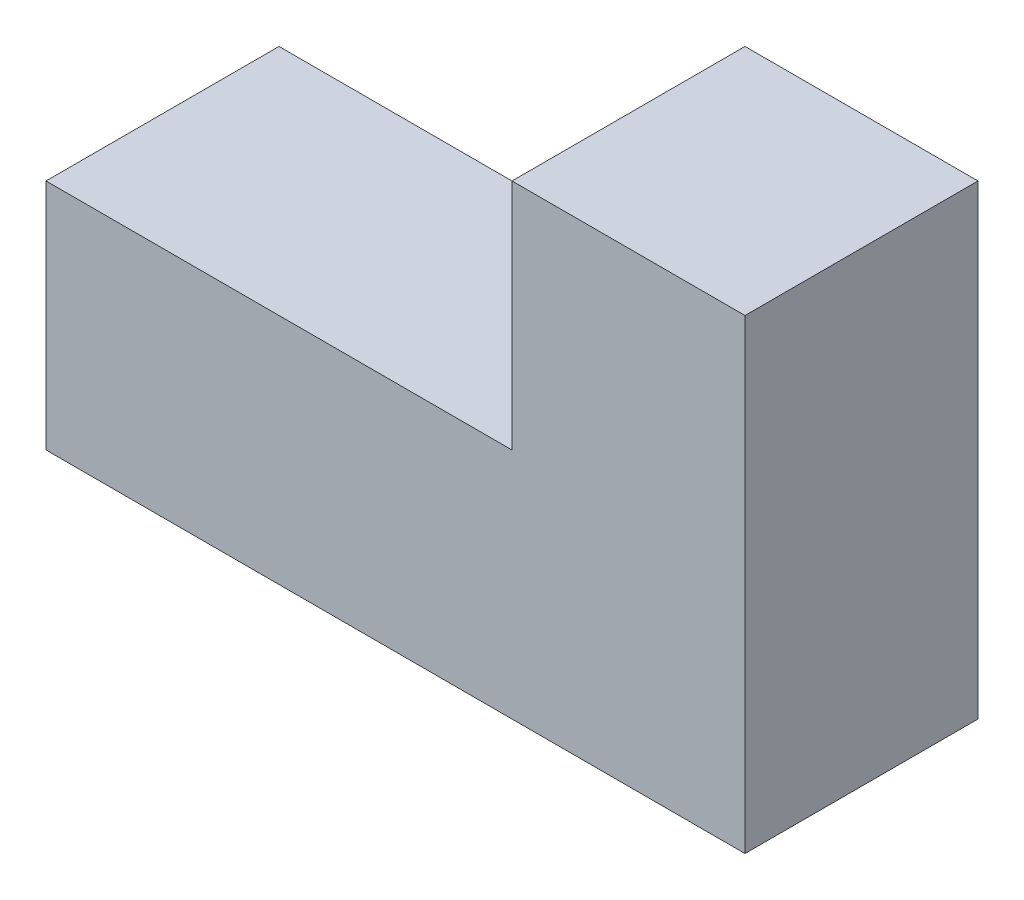
ISO-10303-21;
HEADER;
FILE_DESCRIPTION(('STEP AP214'),'2;1');
FILE_NAME('part.step','',(''),(''),'','','');
FILE_SCHEMA(('AUTOMOTIVE_DESIGN { 1 0 10303 214 1 1 1 1 }'));
ENDSEC;
DATA;
#1=APPLICATION_CONTEXT('core data for automotive mechanical design processes');
#2=APPLICATION_PROTOCOL_DEFINITION('international standard','automotive_design',2000,#1);
#3=PRODUCT_CONTEXT('',#1,'mechanical');
#4=PRODUCT('Part','Part','',(#3));
#5=PRODUCT_RELATED_PRODUCT_CATEGORY('part','',(#4));
#6=PRODUCT_DEFINITION_FORMATION('','',#4);
#7=PRODUCT_DEFINITION_CONTEXT('part definition',#1,'design');
#8=PRODUCT_DEFINITION('design','',#6,#7);
#9=PRODUCT_DEFINITION_SHAPE('','',#8);
#10=(LENGTH_UNIT() NAMED_UNIT(*) SI_UNIT(.MILLI.,.METRE.));
#11=(NAMED_UNIT(*) PLANE_ANGLE_UNIT() SI_UNIT($,.RADIAN.));
#12=(NAMED_UNIT(*) SI_UNIT($,.STERADIAN.) SOLID_ANGLE_UNIT());
#13=UNCERTAINTY_MEASURE_WITH_UNIT(LENGTH_MEASURE(1.E-05),#10,'distance_accuracy_value','');
#14=(GEOMETRIC_REPRESENTATION_CONTEXT(3) GLOBAL_UNCERTAINTY_ASSIGNED_CONTEXT((#13)) GLOBAL_UNIT_ASSIGNED_CONTEXT((#10,
#11,#12)) REPRESENTATION_CONTEXT('',''));
#15=CARTESIAN_POINT('',(0.,0.,0.));
#16=DIRECTION('',(0.,0.,1.));
#17=DIRECTION('',(1.,0.,0.));
#18=AXIS2_PLACEMENT_3D('',#15,#16,#17);
#19=CARTESIAN_POINT('',(0.,0.,30.));
#20=DIRECTION('',(0.,-1.,0.));
#21=DIRECTION('',(0.,0.,-1.));
#22=AXIS2_PLACEMENT_3D('',#19,#20,#21);
#23=PLANE('',#22);
#24=DIRECTION('',(0.,0.,1.));
#25=VECTOR('',#24,1.);
#26=CARTESIAN_POINT('',(60.,0.,0.));
#27=LINE('',#26,#25);
#28=CARTESIAN_POINT('',(60.,0.,0.));
#29=VERTEX_POINT('',#28);
#30=CARTESIAN_POINT('',(60.,0.,30.));
#31=VERTEX_POINT('',#30);
#32=EDGE_CURVE('E48',#29,#31,#27,.T.);
#33=ORIENTED_EDGE('',*,*,#32,.F.);
#34=DIRECTION('',(-1.,0.,0.));
#35=VECTOR('',#34,1.);
#36=CARTESIAN_POINT('',(0.,0.,0.));
#37=LINE('',#36,#35);
#38=CARTESIAN_POINT('',(0.,0.,0.));
#39=VERTEX_POINT('',#38);
#40=EDGE_CURVE('E70',#29,#39,#37,.T.);
#41=ORIENTED_EDGE('',*,*,#40,.T.);
#42=DIRECTION('',(0.,0.,-1.));
#43=VECTOR('',#42,1.);
#44=CARTESIAN_POINT('',(0.,0.,30.));
#45=LINE('',#44,#43);
#46=CARTESIAN_POINT('',(0.,0.,30.));
#47=VERTEX_POINT('',#46);
#48=EDGE_CURVE('E131',#47,#39,#45,.T.);
#49=ORIENTED_EDGE('',*,*,#48,.F.);
#50=DIRECTION('',(-1.,0.,0.));
#51=VECTOR('',#50,1.);
#52=CARTESIAN_POINT('',(0.,0.,30.));
#53=LINE('',#52,#51);
#54=EDGE_CURVE('E56',#31,#47,#53,.T.);
#55=ORIENTED_EDGE('',*,*,#54,.F.);
#56=EDGE_LOOP('',(#33,#41,#49,#55));
#57=FACE_BOUND('',#56,.T.);
#58=ADVANCED_FACE('F33',(#57),#23,.F.);
#59=CARTESIAN_POINT('',(0.,-30.,30.));
#60=DIRECTION('',(1.,0.,0.));
#61=DIRECTION('',(0.,1.,0.));
#62=AXIS2_PLACEMENT_3D('',#59,#60,#61);
#63=PLANE('',#62);
#64=DIRECTION('',(0.,-1.,0.));
#65=VECTOR('',#64,1.);
#66=CARTESIAN_POINT('',(0.,-30.,0.));
#67=LINE('',#66,#65);
#68=CARTESIAN_POINT('',(0.,-30.,0.));
#69=VERTEX_POINT('',#68);
#70=EDGE_CURVE('E124',#39,#69,#67,.T.);
#71=ORIENTED_EDGE('',*,*,#70,.T.);
#72=DIRECTION('',(0.,0.,-1.));
#73=VECTOR('',#72,1.);
#74=CARTESIAN_POINT('',(0.,-30.,30.));
#75=LINE('',#74,#73);
#76=CARTESIAN_POINT('',(0.,-30.,30.));
#77=VERTEX_POINT('',#76);
#78=EDGE_CURVE('E11',#77,#69,#75,.T.);
#79=ORIENTED_EDGE('',*,*,#78,.F.);
#80=DIRECTION('',(0.,-1.,0.));
#81=VECTOR('',#80,1.);
#82=CARTESIAN_POINT('',(0.,-30.,30.));
#83=LINE('',#82,#81);
#84=EDGE_CURVE('E125',#47,#77,#83,.T.);
#85=ORIENTED_EDGE('',*,*,#84,.F.);
#86=ORIENTED_EDGE('',*,*,#48,.T.);
#87=EDGE_LOOP('',(#71,#79,#85,#86));
#88=FACE_BOUND('',#87,.T.);
#89=ADVANCED_FACE('F35',(#88),#63,.F.);
#90=CARTESIAN_POINT('',(90.,-30.,30.));
#91=DIRECTION('',(0.,1.,0.));
#92=DIRECTION('',(-1.,0.,0.));
#93=AXIS2_PLACEMENT_3D('',#90,#91,#92);
#94=PLANE('',#93);
#95=DIRECTION('',(1.,0.,0.));
#96=VECTOR('',#95,1.);
#97=CARTESIAN_POINT('',(90.,-30.,0.));
#98=LINE('',#97,#96);
#99=CARTESIAN_POINT('',(90.,-30.,0.));
#100=VERTEX_POINT('',#99);
#101=EDGE_CURVE('E100',#69,#100,#98,.T.);
#102=ORIENTED_EDGE('',*,*,#101,.T.);
#103=DIRECTION('',(0.,0.,-1.));
#104=VECTOR('',#103,1.);
#105=CARTESIAN_POINT('',(90.,-30.,30.));
#106=LINE('',#105,#104);
#107=CARTESIAN_POINT('',(90.,-30.,30.));
#108=VERTEX_POINT('',#107);
#109=EDGE_CURVE('E41',#108,#100,#106,.T.);
#110=ORIENTED_EDGE('',*,*,#109,.F.);
#111=DIRECTION('',(1.,0.,0.));
#112=VECTOR('',#111,1.);
#113=CARTESIAN_POINT('',(90.,-30.,30.));
#114=LINE('',#113,#112);
#115=EDGE_CURVE('E75',#77,#108,#114,.T.);
#116=ORIENTED_EDGE('',*,*,#115,.F.);
#117=ORIENTED_EDGE('',*,*,#78,.T.);
#118=EDGE_LOOP('',(#102,#110,#116,#117));
#119=FACE_BOUND('',#118,.T.);
#120=ADVANCED_FACE('F139',(#119),#94,.F.);
#121=CARTESIAN_POINT('',(90.,0.,30.));
#122=DIRECTION('',(-1.,0.,0.));
#123=DIRECTION('',(0.,0.,1.));
#124=AXIS2_PLACEMENT_3D('',#121,#122,#123);
#125=PLANE('',#124);
#126=DIRECTION('',(0.,1.,0.));
#127=VECTOR('',#126,1.);
#128=CARTESIAN_POINT('',(90.,0.,0.));
#129=LINE('',#128,#127);
#130=CARTESIAN_POINT('',(90.,30.,0.));
#131=VERTEX_POINT('',#130);
#132=EDGE_CURVE('E93',#100,#131,#129,.T.);
#133=ORIENTED_EDGE('',*,*,#132,.T.);
#134=DIRECTION('',(0.,0.,-1.));
#135=VECTOR('',#134,1.);
#136=CARTESIAN_POINT('',(90.,30.,30.));
#137=LINE('',#136,#135);
#138=CARTESIAN_POINT('',(90.,30.,30.));
#139=VERTEX_POINT('',#138);
#140=EDGE_CURVE('E98',#139,#131,#137,.T.);
#141=ORIENTED_EDGE('',*,*,#140,.F.);
#142=DIRECTION('',(0.,1.,0.));
#143=VECTOR('',#142,1.);
#144=CARTESIAN_POINT('',(90.,0.,30.));
#145=LINE('',#144,#143);
#146=EDGE_CURVE('E128',#108,#139,#145,.T.);
#147=ORIENTED_EDGE('',*,*,#146,.F.);
#148=ORIENTED_EDGE('',*,*,#109,.T.);
#149=EDGE_LOOP('',(#133,#141,#147,#148));
#150=FACE_BOUND('',#149,.T.);
#151=ADVANCED_FACE('F95',(#150),#125,.F.);
#152=CARTESIAN_POINT('',(0.,0.,30.));
#153=DIRECTION('',(0.,0.,-1.));
#154=DIRECTION('',(-1.,0.,0.));
#155=AXIS2_PLACEMENT_3D('',#152,#153,#154);
#156=PLANE('',#155);
#157=ORIENTED_EDGE('',*,*,#84,.T.);
#158=ORIENTED_EDGE('',*,*,#115,.T.);
#159=ORIENTED_EDGE('',*,*,#146,.T.);
#160=DIRECTION('',(1.,0.,0.));
#161=VECTOR('',#160,1.);
#162=CARTESIAN_POINT('',(60.,30.,30.));
#163=LINE('',#162,#161);
#164=CARTESIAN_POINT('',(60.,30.,30.));
#165=VERTEX_POINT('',#164);
#166=EDGE_CURVE('E115',#165,#139,#163,.T.);
#167=ORIENTED_EDGE('',*,*,#166,.F.);
#168=DIRECTION('',(0.,-1.,0.));
#169=VECTOR('',#168,1.);
#170=CARTESIAN_POINT('',(60.,30.,30.));
#171=LINE('',#170,#169);
#172=EDGE_CURVE('E120',#165,#31,#171,.T.);
#173=ORIENTED_EDGE('',*,*,#172,.T.);
#174=ORIENTED_EDGE('',*,*,#54,.T.);
#175=EDGE_LOOP('',(#157,#158,#159,#167,#173,#174));
#176=FACE_BOUND('',#175,.T.);
#177=ADVANCED_FACE('F145',(#176),#156,.F.);
#178=CARTESIAN_POINT('',(0.,0.,0.));
#179=DIRECTION('',(0.,0.,-1.));
#180=DIRECTION('',(-1.,0.,0.));
#181=AXIS2_PLACEMENT_3D('',#178,#179,#180);
#182=PLANE('',#181);
#183=ORIENTED_EDGE('',*,*,#70,.F.);
#184=ORIENTED_EDGE('',*,*,#40,.F.);
#185=DIRECTION('',(0.,-1.,0.));
#186=VECTOR('',#185,1.);
#187=CARTESIAN_POINT('',(60.,30.,0.));
#188=LINE('',#187,#186);
#189=CARTESIAN_POINT('',(60.,30.,0.));
#190=VERTEX_POINT('',#189);
#191=EDGE_CURVE('E107',#190,#29,#188,.T.);
#192=ORIENTED_EDGE('',*,*,#191,.F.);
#193=DIRECTION('',(-1.,0.,0.));
#194=VECTOR('',#193,1.);
#195=CARTESIAN_POINT('',(90.,30.,0.));
#196=LINE('',#195,#194);
#197=EDGE_CURVE('E103',#131,#190,#196,.T.);
#198=ORIENTED_EDGE('',*,*,#197,.F.);
#199=ORIENTED_EDGE('',*,*,#132,.F.);
#200=ORIENTED_EDGE('',*,*,#101,.F.);
#201=EDGE_LOOP('',(#183,#184,#192,#198,#199,#200));
#202=FACE_BOUND('',#201,.T.);
#203=ADVANCED_FACE('F105',(#202),#182,.T.);
#204=CARTESIAN_POINT('',(60.,30.,0.));
#205=DIRECTION('',(1.,0.,0.));
#206=DIRECTION('',(0.,0.,-1.));
#207=AXIS2_PLACEMENT_3D('',#204,#205,#206);
#208=PLANE('',#207);
#209=ORIENTED_EDGE('',*,*,#32,.T.);
#210=ORIENTED_EDGE('',*,*,#172,.F.);
#211=DIRECTION('',(0.,0.,1.));
#212=VECTOR('',#211,1.);
#213=CARTESIAN_POINT('',(60.,30.,0.));
#214=LINE('',#213,#212);
#215=EDGE_CURVE('E110',#190,#165,#214,.T.);
#216=ORIENTED_EDGE('',*,*,#215,.F.);
#217=ORIENTED_EDGE('',*,*,#191,.T.);
#218=EDGE_LOOP('',(#209,#210,#216,#217));
#219=FACE_BOUND('',#218,.T.);
#220=ADVANCED_FACE('F154',(#219),#208,.F.);
#221=CARTESIAN_POINT('',(0.,30.,0.));
#222=DIRECTION('',(0.,1.,0.));
#223=DIRECTION('',(0.,0.,1.));
#224=AXIS2_PLACEMENT_3D('',#221,#222,#223);
#225=PLANE('',#224);
#226=ORIENTED_EDGE('',*,*,#140,.T.);
#227=ORIENTED_EDGE('',*,*,#197,.T.);
#228=ORIENTED_EDGE('',*,*,#215,.T.);
#229=ORIENTED_EDGE('',*,*,#166,.T.);
#230=EDGE_LOOP('',(#226,#227,#228,#229));
#231=FACE_BOUND('',#230,.T.);
#232=ADVANCED_FACE('F113',(#231),#225,.T.);
#233=CLOSED_SHELL('',(#58,#89,#120,#151,#177,#203,#220,#232));
#234=MANIFOLD_SOLID_BREP('B2',#233);
#235=ADVANCED_BREP_SHAPE_REPRESENTATION('',(#18,#234),#14);
#236=SHAPE_DEFINITION_REPRESENTATION(#9,#235);
ENDSEC;
END-ISO-10303-21;
